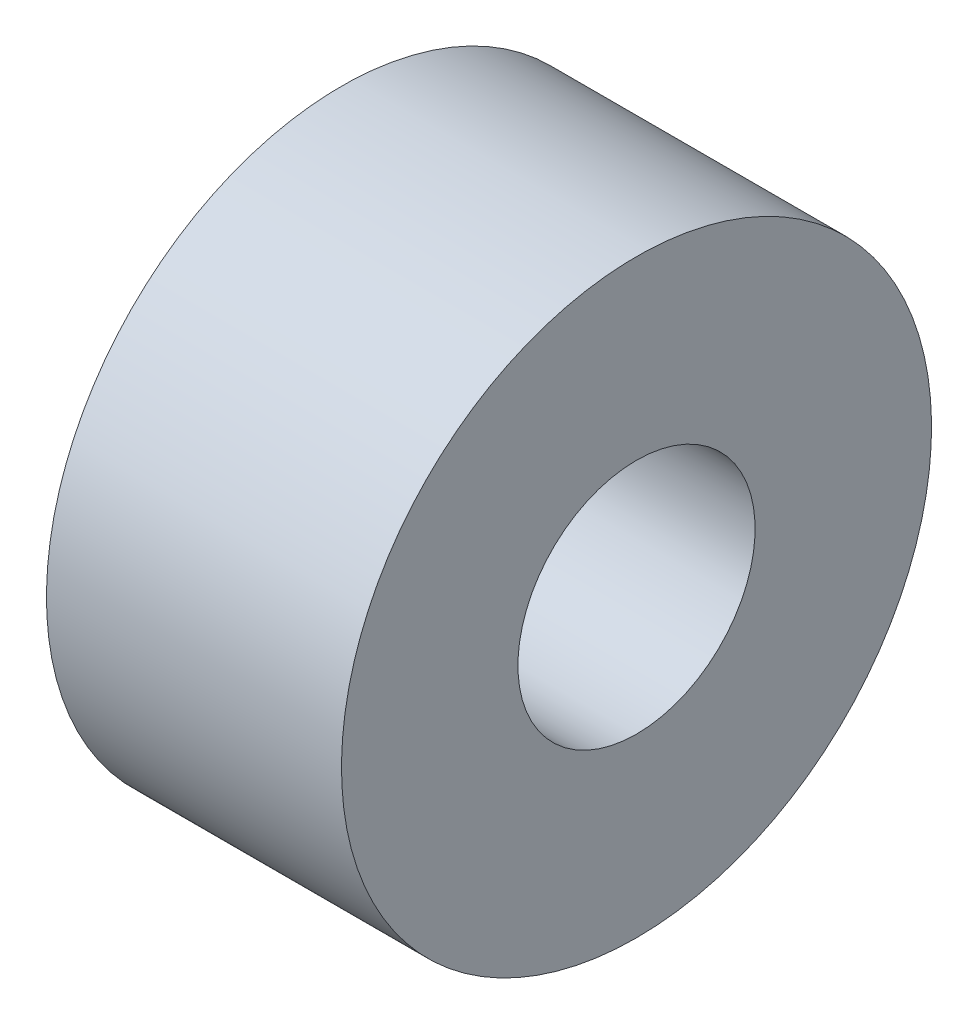
ISO-10303-21;
HEADER;
FILE_DESCRIPTION(('STEP AP214'),'2;1');
FILE_NAME('part.step','',(''),(''),'','','');
FILE_SCHEMA(('AUTOMOTIVE_DESIGN { 1 0 10303 214 1 1 1 1 }'));
ENDSEC;
DATA;
#1=APPLICATION_CONTEXT('core data for automotive mechanical design processes');
#2=APPLICATION_PROTOCOL_DEFINITION('international standard','automotive_design',2000,#1);
#3=PRODUCT_CONTEXT('',#1,'mechanical');
#4=PRODUCT('Part','Part','',(#3));
#5=PRODUCT_RELATED_PRODUCT_CATEGORY('part','',(#4));
#6=PRODUCT_DEFINITION_FORMATION('','',#4);
#7=PRODUCT_DEFINITION_CONTEXT('part definition',#1,'design');
#8=PRODUCT_DEFINITION('design','',#6,#7);
#9=PRODUCT_DEFINITION_SHAPE('','',#8);
#10=(LENGTH_UNIT() NAMED_UNIT(*) SI_UNIT(.MILLI.,.METRE.));
#11=(NAMED_UNIT(*) PLANE_ANGLE_UNIT() SI_UNIT($,.RADIAN.));
#12=(NAMED_UNIT(*) SI_UNIT($,.STERADIAN.) SOLID_ANGLE_UNIT());
#13=UNCERTAINTY_MEASURE_WITH_UNIT(LENGTH_MEASURE(1.E-05),#10,'distance_accuracy_value','');
#14=(GEOMETRIC_REPRESENTATION_CONTEXT(3) GLOBAL_UNCERTAINTY_ASSIGNED_CONTEXT((#13)) GLOBAL_UNIT_ASSIGNED_CONTEXT((#10,
#11,#12)) REPRESENTATION_CONTEXT('',''));
#15=CARTESIAN_POINT('',(0.,0.,0.));
#16=DIRECTION('',(0.,0.,1.));
#17=DIRECTION('',(1.,0.,0.));
#18=AXIS2_PLACEMENT_3D('',#15,#16,#17);
#19=CARTESIAN_POINT('',(-349.25,-241.3,206.88711980234));
#20=DIRECTION('',(1.,0.,0.));
#21=DIRECTION('',(0.,1.,0.));
#22=AXIS2_PLACEMENT_3D('',#19,#20,#21);
#23=CYLINDRICAL_SURFACE('',#22,2.5527);
#24=CARTESIAN_POINT('',(-349.25,-241.3,206.88711980234));
#25=DIRECTION('',(1.,0.,0.));
#26=DIRECTION('',(0.,1.,0.));
#27=AXIS2_PLACEMENT_3D('',#24,#25,#26);
#28=CIRCLE('',#27,2.5527);
#29=CARTESIAN_POINT('',(-349.25,-238.7473,206.88711980234));
#30=VERTEX_POINT('',#29);
#31=EDGE_CURVE('E23',#30,#30,#28,.T.);
#32=ORIENTED_EDGE('',*,*,#31,.F.);
#33=EDGE_LOOP('',(#32));
#34=FACE_BOUND('',#33,.T.);
#35=CARTESIAN_POINT('',(-342.9,-241.3,206.88711980234));
#36=DIRECTION('',(1.,0.,0.));
#37=DIRECTION('',(0.,1.,0.));
#38=AXIS2_PLACEMENT_3D('',#35,#36,#37);
#39=CIRCLE('',#38,2.5527);
#40=CARTESIAN_POINT('',(-342.9,-238.7473,206.88711980234));
#41=VERTEX_POINT('',#40);
#42=EDGE_CURVE('E32',#41,#41,#39,.T.);
#43=ORIENTED_EDGE('',*,*,#42,.T.);
#44=EDGE_LOOP('',(#43));
#45=FACE_BOUND('',#44,.T.);
#46=ADVANCED_FACE('F15',(#34,#45),#23,.F.);
#47=CARTESIAN_POINT('',(-349.25,-241.3,206.88711980234));
#48=DIRECTION('',(1.,0.,0.));
#49=DIRECTION('',(0.,1.,0.));
#50=AXIS2_PLACEMENT_3D('',#47,#48,#49);
#51=CYLINDRICAL_SURFACE('',#50,6.35);
#52=CARTESIAN_POINT('',(-349.25,-241.3,206.88711980234));
#53=DIRECTION('',(-1.,0.,0.));
#54=DIRECTION('',(0.,-1.,0.));
#55=AXIS2_PLACEMENT_3D('',#52,#53,#54);
#56=CIRCLE('',#55,6.35);
#57=CARTESIAN_POINT('',(-349.25,-247.65,206.88711980234));
#58=VERTEX_POINT('',#57);
#59=EDGE_CURVE('E10',#58,#58,#56,.T.);
#60=ORIENTED_EDGE('',*,*,#59,.F.);
#61=EDGE_LOOP('',(#60));
#62=FACE_BOUND('',#61,.T.);
#63=CARTESIAN_POINT('',(-342.9,-241.3,206.88711980234));
#64=DIRECTION('',(-1.,0.,0.));
#65=DIRECTION('',(0.,-1.,0.));
#66=AXIS2_PLACEMENT_3D('',#63,#64,#65);
#67=CIRCLE('',#66,6.35);
#68=CARTESIAN_POINT('',(-342.9,-247.65,206.88711980234));
#69=VERTEX_POINT('',#68);
#70=EDGE_CURVE('E18',#69,#69,#67,.T.);
#71=ORIENTED_EDGE('',*,*,#70,.T.);
#72=EDGE_LOOP('',(#71));
#73=FACE_BOUND('',#72,.T.);
#74=ADVANCED_FACE('F40',(#62,#73),#51,.T.);
#75=CARTESIAN_POINT('',(-349.25,-258.667038367136,180.437309901171));
#76=DIRECTION('',(-1.,0.,0.));
#77=DIRECTION('',(0.,-1.,0.));
#78=AXIS2_PLACEMENT_3D('',#75,#76,#77);
#79=PLANE('',#78);
#80=ORIENTED_EDGE('',*,*,#31,.T.);
#81=EDGE_LOOP('',(#80));
#82=FACE_BOUND('',#81,.T.);
#83=ORIENTED_EDGE('',*,*,#59,.T.);
#84=EDGE_LOOP('',(#83));
#85=FACE_BOUND('',#84,.T.);
#86=ADVANCED_FACE('F44',(#82,#85),#79,.T.);
#87=CARTESIAN_POINT('',(-342.9,-258.667038367136,180.437309901171));
#88=DIRECTION('',(-1.,0.,0.));
#89=DIRECTION('',(0.,-1.,0.));
#90=AXIS2_PLACEMENT_3D('',#87,#88,#89);
#91=PLANE('',#90);
#92=ORIENTED_EDGE('',*,*,#42,.F.);
#93=EDGE_LOOP('',(#92));
#94=FACE_BOUND('',#93,.T.);
#95=ORIENTED_EDGE('',*,*,#70,.F.);
#96=EDGE_LOOP('',(#95));
#97=FACE_BOUND('',#96,.T.);
#98=ADVANCED_FACE('F42',(#94,#97),#91,.F.);
#99=CLOSED_SHELL('',(#46,#74,#86,#98));
#100=MANIFOLD_SOLID_BREP('B1',#99);
#101=ADVANCED_BREP_SHAPE_REPRESENTATION('',(#18,#100),#14);
#102=SHAPE_DEFINITION_REPRESENTATION(#9,#101);
ENDSEC;
END-ISO-10303-21;
